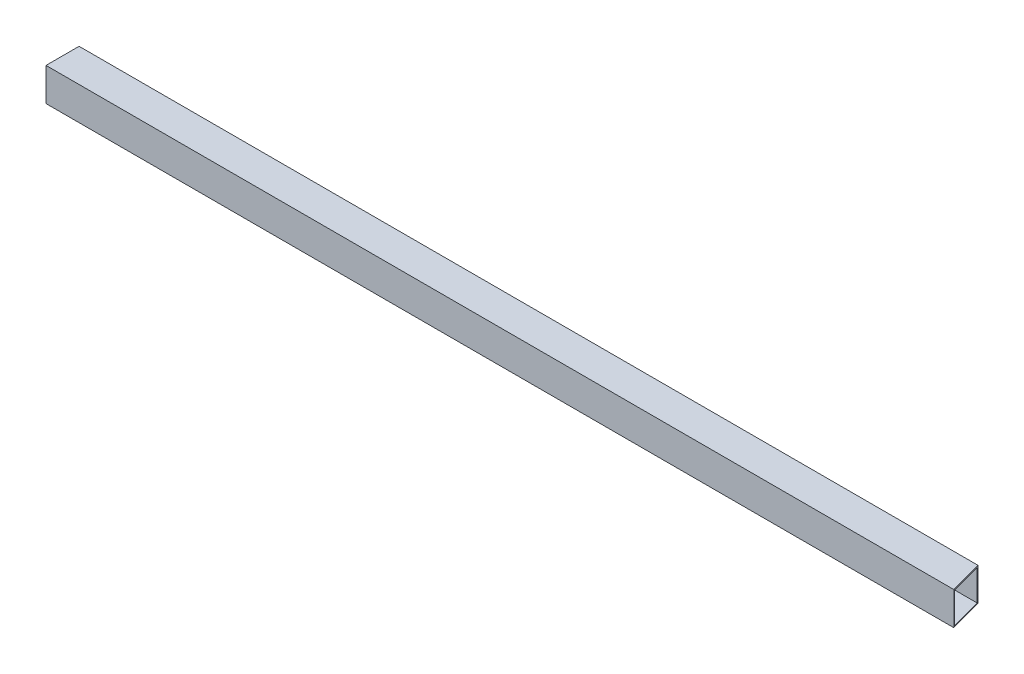
ISO-10303-21;
HEADER;
FILE_DESCRIPTION(('STEP AP214'),'2;1');
FILE_NAME('part.step','',(''),(''),'','','');
FILE_SCHEMA(('AUTOMOTIVE_DESIGN { 1 0 10303 214 1 1 1 1 }'));
ENDSEC;
DATA;
#1=APPLICATION_CONTEXT('core data for automotive mechanical design processes');
#2=APPLICATION_PROTOCOL_DEFINITION('international standard','automotive_design',2000,#1);
#3=PRODUCT_CONTEXT('',#1,'mechanical');
#4=PRODUCT('Part','Part','',(#3));
#5=PRODUCT_RELATED_PRODUCT_CATEGORY('part','',(#4));
#6=PRODUCT_DEFINITION_FORMATION('','',#4);
#7=PRODUCT_DEFINITION_CONTEXT('part definition',#1,'design');
#8=PRODUCT_DEFINITION('design','',#6,#7);
#9=PRODUCT_DEFINITION_SHAPE('','',#8);
#10=(LENGTH_UNIT() NAMED_UNIT(*) SI_UNIT(.MILLI.,.METRE.));
#11=(NAMED_UNIT(*) PLANE_ANGLE_UNIT() SI_UNIT($,.RADIAN.));
#12=(NAMED_UNIT(*) SI_UNIT($,.STERADIAN.) SOLID_ANGLE_UNIT());
#13=UNCERTAINTY_MEASURE_WITH_UNIT(LENGTH_MEASURE(1.E-05),#10,'distance_accuracy_value','');
#14=(GEOMETRIC_REPRESENTATION_CONTEXT(3) GLOBAL_UNCERTAINTY_ASSIGNED_CONTEXT((#13)) GLOBAL_UNIT_ASSIGNED_CONTEXT((#10,
#11,#12)) REPRESENTATION_CONTEXT('',''));
#15=CARTESIAN_POINT('',(0.,0.,0.));
#16=DIRECTION('',(0.,0.,1.));
#17=DIRECTION('',(1.,0.,0.));
#18=AXIS2_PLACEMENT_3D('',#15,#16,#17);
#19=CARTESIAN_POINT('',(-300.,56.,56.));
#20=DIRECTION('',(0.,0.,-1.));
#21=DIRECTION('',(0.,-1.,0.));
#22=AXIS2_PLACEMENT_3D('',#19,#20,#21);
#23=PLANE('',#22);
#24=DIRECTION('',(0.,-1.,0.));
#25=VECTOR('',#24,1.);
#26=CARTESIAN_POINT('',(0.,-10859.5,56.000000000001));
#27=LINE('',#26,#25);
#28=CARTESIAN_POINT('',(0.,56.,56.));
#29=VERTEX_POINT('',#28);
#30=CARTESIAN_POINT('',(0.,-56.,56.));
#31=VERTEX_POINT('',#30);
#32=EDGE_CURVE('E168',#29,#31,#27,.T.);
#33=ORIENTED_EDGE('',*,*,#32,.F.);
#34=DIRECTION('',(1.,0.,0.));
#35=VECTOR('',#34,1.);
#36=CARTESIAN_POINT('',(-300.,56.,56.));
#37=LINE('',#36,#35);
#38=CARTESIAN_POINT('',(3291.792966701,56.,56.));
#39=VERTEX_POINT('',#38);
#40=EDGE_CURVE('E11',#29,#39,#37,.T.);
#41=ORIENTED_EDGE('',*,*,#40,.T.);
#42=DIRECTION('',(0.,1.,0.));
#43=VECTOR('',#42,1.);
#44=CARTESIAN_POINT('',(3291.792966701,-859.5,56.));
#45=LINE('',#44,#43);
#46=CARTESIAN_POINT('',(3291.792966701,-56.,56.));
#47=VERTEX_POINT('',#46);
#48=EDGE_CURVE('E162',#47,#39,#45,.T.);
#49=ORIENTED_EDGE('',*,*,#48,.F.);
#50=DIRECTION('',(1.,0.,0.));
#51=VECTOR('',#50,1.);
#52=CARTESIAN_POINT('',(-300.,-56.,56.));
#53=LINE('',#52,#51);
#54=EDGE_CURVE('E64',#31,#47,#53,.T.);
#55=ORIENTED_EDGE('',*,*,#54,.F.);
#56=EDGE_LOOP('',(#33,#41,#49,#55));
#57=FACE_BOUND('',#56,.T.);
#58=ADVANCED_FACE('F17',(#57),#23,.T.);
#59=CARTESIAN_POINT('',(-300.,56.,-56.));
#60=DIRECTION('',(0.,-1.,0.));
#61=DIRECTION('',(-1.,0.,0.));
#62=AXIS2_PLACEMENT_3D('',#59,#60,#61);
#63=PLANE('',#62);
#64=DIRECTION('',(0.,0.,1.));
#65=VECTOR('',#64,1.);
#66=CARTESIAN_POINT('',(0.,56.000000000001,9332.));
#67=LINE('',#66,#65);
#68=CARTESIAN_POINT('',(0.,56.,-56.));
#69=VERTEX_POINT('',#68);
#70=EDGE_CURVE('E152',#69,#29,#67,.T.);
#71=ORIENTED_EDGE('',*,*,#70,.F.);
#72=DIRECTION('',(1.,0.,0.));
#73=VECTOR('',#72,1.);
#74=CARTESIAN_POINT('',(-300.,56.,-56.));
#75=LINE('',#74,#73);
#76=CARTESIAN_POINT('',(3261.782657149,56.,-56.));
#77=VERTEX_POINT('',#76);
#78=EDGE_CURVE('E27',#69,#77,#75,.T.);
#79=ORIENTED_EDGE('',*,*,#78,.T.);
#80=DIRECTION('',(-0.258819045102985,0.,-0.965925826288944));
#81=VECTOR('',#80,1.);
#82=CARTESIAN_POINT('',(2985.036923932,56.,-1088.829137143));
#83=LINE('',#82,#81);
#84=EDGE_CURVE('E188',#39,#77,#83,.T.);
#85=ORIENTED_EDGE('',*,*,#84,.F.);
#86=ORIENTED_EDGE('',*,*,#40,.F.);
#87=EDGE_LOOP('',(#71,#79,#85,#86));
#88=FACE_BOUND('',#87,.T.);
#89=ADVANCED_FACE('F205',(#88),#63,.T.);
#90=CARTESIAN_POINT('',(-300.,-56.,-56.));
#91=DIRECTION('',(0.,0.,1.));
#92=DIRECTION('',(0.,-1.,0.));
#93=AXIS2_PLACEMENT_3D('',#90,#91,#92);
#94=PLANE('',#93);
#95=DIRECTION('',(0.,1.,0.));
#96=VECTOR('',#95,1.);
#97=CARTESIAN_POINT('',(0.,-10915.5,-55.99999999999));
#98=LINE('',#97,#96);
#99=CARTESIAN_POINT('',(0.,-56.,-56.));
#100=VERTEX_POINT('',#99);
#101=EDGE_CURVE('E174',#100,#69,#98,.T.);
#102=ORIENTED_EDGE('',*,*,#101,.F.);
#103=DIRECTION('',(1.,0.,0.));
#104=VECTOR('',#103,1.);
#105=CARTESIAN_POINT('',(-300.,-56.,-56.));
#106=LINE('',#105,#104);
#107=CARTESIAN_POINT('',(3261.782657149,-56.,-56.));
#108=VERTEX_POINT('',#107);
#109=EDGE_CURVE('E39',#100,#108,#106,.T.);
#110=ORIENTED_EDGE('',*,*,#109,.T.);
#111=DIRECTION('',(0.,-1.,0.));
#112=VECTOR('',#111,1.);
#113=CARTESIAN_POINT('',(3261.782657149,-915.5,-56.));
#114=LINE('',#113,#112);
#115=EDGE_CURVE('E192',#77,#108,#114,.T.);
#116=ORIENTED_EDGE('',*,*,#115,.F.);
#117=ORIENTED_EDGE('',*,*,#78,.F.);
#118=EDGE_LOOP('',(#102,#110,#116,#117));
#119=FACE_BOUND('',#118,.T.);
#120=ADVANCED_FACE('F19',(#119),#94,.T.);
#121=CARTESIAN_POINT('',(-300.,-56.,56.));
#122=DIRECTION('',(0.,1.,0.));
#123=DIRECTION('',(0.,0.,-1.));
#124=AXIS2_PLACEMENT_3D('',#121,#122,#123);
#125=PLANE('',#124);
#126=DIRECTION('',(0.,0.,-1.));
#127=VECTOR('',#126,1.);
#128=CARTESIAN_POINT('',(0.,-55.99999999999,9388.));
#129=LINE('',#128,#127);
#130=EDGE_CURVE('E167',#31,#100,#129,.T.);
#131=ORIENTED_EDGE('',*,*,#130,.F.);
#132=ORIENTED_EDGE('',*,*,#54,.T.);
#133=DIRECTION('',(0.258819045102985,0.,0.965925826288944));
#134=VECTOR('',#133,1.);
#135=CARTESIAN_POINT('',(2999.036923932,-56.,-1036.580425837));
#136=LINE('',#135,#134);
#137=EDGE_CURVE('E196',#108,#47,#136,.T.);
#138=ORIENTED_EDGE('',*,*,#137,.F.);
#139=ORIENTED_EDGE('',*,*,#109,.F.);
#140=EDGE_LOOP('',(#131,#132,#138,#139));
#141=FACE_BOUND('',#140,.T.);
#142=ADVANCED_FACE('F221',(#141),#125,.T.);
#143=CARTESIAN_POINT('',(-300.,60.,60.));
#144=DIRECTION('',(0.,0.,-1.));
#145=DIRECTION('',(0.,-1.,0.));
#146=AXIS2_PLACEMENT_3D('',#143,#144,#145);
#147=PLANE('',#146);
#148=DIRECTION('',(1.,0.,0.));
#149=VECTOR('',#148,1.);
#150=CARTESIAN_POINT('',(-300.,-60.,60.));
#151=LINE('',#150,#149);
#152=CARTESIAN_POINT('',(0.,-60.,60.));
#153=VERTEX_POINT('',#152);
#154=CARTESIAN_POINT('',(3292.864763471,-60.,60.));
#155=VERTEX_POINT('',#154);
#156=EDGE_CURVE('E199',#153,#155,#151,.T.);
#157=ORIENTED_EDGE('',*,*,#156,.T.);
#158=DIRECTION('',(0.,1.,0.));
#159=VECTOR('',#158,1.);
#160=CARTESIAN_POINT('',(3292.864763471,-857.5,60.));
#161=LINE('',#160,#159);
#162=CARTESIAN_POINT('',(3292.864763471,60.,60.));
#163=VERTEX_POINT('',#162);
#164=EDGE_CURVE('E163',#155,#163,#161,.T.);
#165=ORIENTED_EDGE('',*,*,#164,.T.);
#166=DIRECTION('',(1.,0.,0.));
#167=VECTOR('',#166,1.);
#168=CARTESIAN_POINT('',(-300.,60.,60.));
#169=LINE('',#168,#167);
#170=CARTESIAN_POINT('',(0.,60.,60.));
#171=VERTEX_POINT('',#170);
#172=EDGE_CURVE('E164',#171,#163,#169,.T.);
#173=ORIENTED_EDGE('',*,*,#172,.F.);
#174=DIRECTION('',(0.,-1.,0.));
#175=VECTOR('',#174,1.);
#176=CARTESIAN_POINT('',(0.,-10857.5,60.000000000001));
#177=LINE('',#176,#175);
#178=EDGE_CURVE('E122',#171,#153,#177,.T.);
#179=ORIENTED_EDGE('',*,*,#178,.T.);
#180=EDGE_LOOP('',(#157,#165,#173,#179));
#181=FACE_BOUND('',#180,.T.);
#182=ADVANCED_FACE('F224',(#181),#147,.F.);
#183=CARTESIAN_POINT('',(-300.,-60.,60.));
#184=DIRECTION('',(0.,1.,0.));
#185=DIRECTION('',(0.,0.,-1.));
#186=AXIS2_PLACEMENT_3D('',#183,#184,#185);
#187=PLANE('',#186);
#188=DIRECTION('',(1.,0.,0.));
#189=VECTOR('',#188,1.);
#190=CARTESIAN_POINT('',(-300.,-60.,-60.));
#191=LINE('',#190,#189);
#192=CARTESIAN_POINT('',(0.,-60.,-60.));
#193=VERTEX_POINT('',#192);
#194=CARTESIAN_POINT('',(3260.710860379,-60.,-60.));
#195=VERTEX_POINT('',#194);
#196=EDGE_CURVE('E135',#193,#195,#191,.T.);
#197=ORIENTED_EDGE('',*,*,#196,.T.);
#198=DIRECTION('',(0.258819045102985,0.,0.965925826288944));
#199=VECTOR('',#198,1.);
#200=CARTESIAN_POINT('',(2999.536923932,-60.,-1034.714400433));
#201=LINE('',#200,#199);
#202=EDGE_CURVE('E158',#195,#155,#201,.T.);
#203=ORIENTED_EDGE('',*,*,#202,.T.);
#204=ORIENTED_EDGE('',*,*,#156,.F.);
#205=DIRECTION('',(0.,0.,-1.));
#206=VECTOR('',#205,1.);
#207=CARTESIAN_POINT('',(0.,-59.99999999999,9390.));
#208=LINE('',#207,#206);
#209=EDGE_CURVE('E127',#153,#193,#208,.T.);
#210=ORIENTED_EDGE('',*,*,#209,.T.);
#211=EDGE_LOOP('',(#197,#203,#204,#210));
#212=FACE_BOUND('',#211,.T.);
#213=ADVANCED_FACE('F227',(#212),#187,.F.);
#214=CARTESIAN_POINT('',(2946.885387365,-1775.,-1231.212609998));
#215=DIRECTION('',(-0.965925826288944,0.,0.258819045102985));
#216=DIRECTION('',(0.,1.,0.));
#217=AXIS2_PLACEMENT_3D('',#214,#215,#216);
#218=PLANE('',#217);
#219=ORIENTED_EDGE('',*,*,#48,.T.);
#220=ORIENTED_EDGE('',*,*,#84,.T.);
#221=ORIENTED_EDGE('',*,*,#115,.T.);
#222=ORIENTED_EDGE('',*,*,#137,.T.);
#223=EDGE_LOOP('',(#219,#220,#221,#222));
#224=FACE_BOUND('',#223,.T.);
#225=ORIENTED_EDGE('',*,*,#164,.F.);
#226=ORIENTED_EDGE('',*,*,#202,.F.);
#227=DIRECTION('',(0.,-1.,0.));
#228=VECTOR('',#227,1.);
#229=CARTESIAN_POINT('',(3260.710860379,-917.5,-60.));
#230=LINE('',#229,#228);
#231=CARTESIAN_POINT('',(3260.710860379,60.,-60.));
#232=VERTEX_POINT('',#231);
#233=EDGE_CURVE('E143',#232,#195,#230,.T.);
#234=ORIENTED_EDGE('',*,*,#233,.F.);
#235=DIRECTION('',(-0.258819045102985,0.,-0.965925826288944));
#236=VECTOR('',#235,1.);
#237=CARTESIAN_POINT('',(2984.536923932,60.,-1090.695162546));
#238=LINE('',#237,#236);
#239=EDGE_CURVE('E140',#163,#232,#238,.T.);
#240=ORIENTED_EDGE('',*,*,#239,.F.);
#241=EDGE_LOOP('',(#225,#226,#234,#240));
#242=FACE_BOUND('',#241,.T.);
#243=ADVANCED_FACE('F208',(#224,#242),#218,.F.);
#244=CARTESIAN_POINT('',(-300.,60.,-60.));
#245=DIRECTION('',(0.,-1.,0.));
#246=DIRECTION('',(-1.,0.,0.));
#247=AXIS2_PLACEMENT_3D('',#244,#245,#246);
#248=PLANE('',#247);
#249=ORIENTED_EDGE('',*,*,#172,.T.);
#250=ORIENTED_EDGE('',*,*,#239,.T.);
#251=DIRECTION('',(1.,0.,0.));
#252=VECTOR('',#251,1.);
#253=CARTESIAN_POINT('',(-300.,60.,-60.));
#254=LINE('',#253,#252);
#255=CARTESIAN_POINT('',(0.,60.,-60.));
#256=VERTEX_POINT('',#255);
#257=EDGE_CURVE('E133',#256,#232,#254,.T.);
#258=ORIENTED_EDGE('',*,*,#257,.F.);
#259=DIRECTION('',(0.,0.,1.));
#260=VECTOR('',#259,1.);
#261=CARTESIAN_POINT('',(0.,60.000000000001,9330.));
#262=LINE('',#261,#260);
#263=EDGE_CURVE('E115',#256,#171,#262,.T.);
#264=ORIENTED_EDGE('',*,*,#263,.T.);
#265=EDGE_LOOP('',(#249,#250,#258,#264));
#266=FACE_BOUND('',#265,.T.);
#267=ADVANCED_FACE('F138',(#266),#248,.F.);
#268=CARTESIAN_POINT('',(0.,-21775.,18720.));
#269=DIRECTION('',(1.,0.,0.));
#270=DIRECTION('',(0.,1.,0.));
#271=AXIS2_PLACEMENT_3D('',#268,#269,#270);
#272=PLANE('',#271);
#273=ORIENTED_EDGE('',*,*,#101,.T.);
#274=ORIENTED_EDGE('',*,*,#70,.T.);
#275=ORIENTED_EDGE('',*,*,#32,.T.);
#276=ORIENTED_EDGE('',*,*,#130,.T.);
#277=EDGE_LOOP('',(#273,#274,#275,#276));
#278=FACE_BOUND('',#277,.T.);
#279=ORIENTED_EDGE('',*,*,#178,.F.);
#280=ORIENTED_EDGE('',*,*,#263,.F.);
#281=DIRECTION('',(0.,1.,0.));
#282=VECTOR('',#281,1.);
#283=CARTESIAN_POINT('',(0.,-10917.5,-59.99999999999));
#284=LINE('',#283,#282);
#285=EDGE_CURVE('E119',#193,#256,#284,.T.);
#286=ORIENTED_EDGE('',*,*,#285,.F.);
#287=ORIENTED_EDGE('',*,*,#209,.F.);
#288=EDGE_LOOP('',(#279,#280,#286,#287));
#289=FACE_BOUND('',#288,.T.);
#290=ADVANCED_FACE('F117',(#278,#289),#272,.F.);
#291=CARTESIAN_POINT('',(-300.,-60.,-60.));
#292=DIRECTION('',(0.,0.,1.));
#293=DIRECTION('',(0.,-1.,0.));
#294=AXIS2_PLACEMENT_3D('',#291,#292,#293);
#295=PLANE('',#294);
#296=ORIENTED_EDGE('',*,*,#257,.T.);
#297=ORIENTED_EDGE('',*,*,#233,.T.);
#298=ORIENTED_EDGE('',*,*,#196,.F.);
#299=ORIENTED_EDGE('',*,*,#285,.T.);
#300=EDGE_LOOP('',(#296,#297,#298,#299));
#301=FACE_BOUND('',#300,.T.);
#302=ADVANCED_FACE('F131',(#301),#295,.F.);
#303=CLOSED_SHELL('',(#58,#89,#120,#142,#182,#213,#243,#267,#290,#302));
#304=MANIFOLD_SOLID_BREP('B1',#303);
#305=ADVANCED_BREP_SHAPE_REPRESENTATION('',(#18,#304),#14);
#306=SHAPE_DEFINITION_REPRESENTATION(#9,#305);
ENDSEC;
END-ISO-10303-21;
